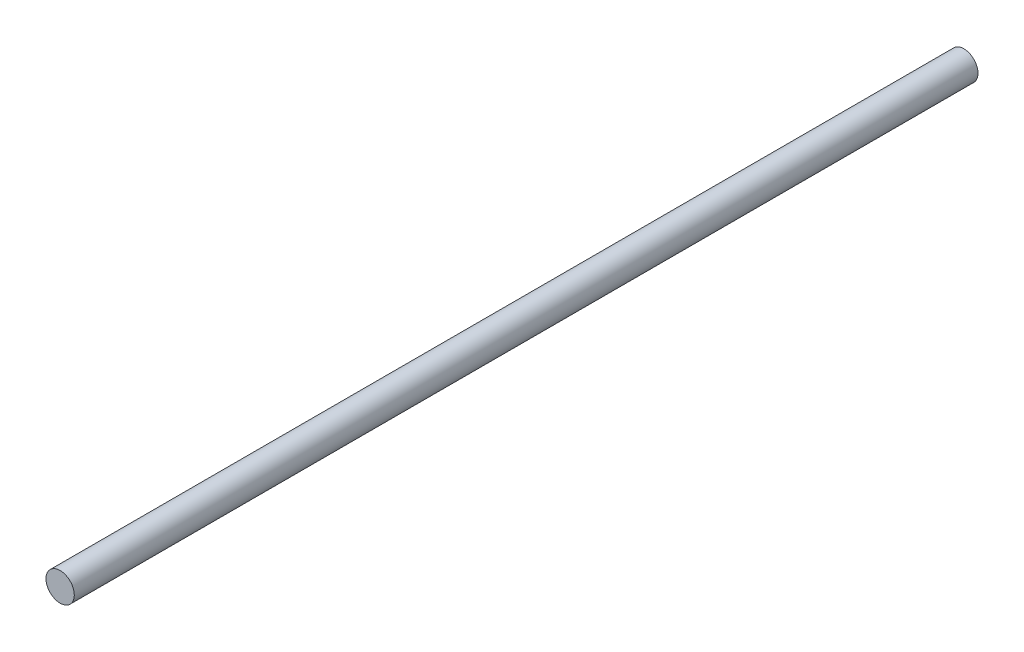
ISO-10303-21;
HEADER;
FILE_DESCRIPTION(('STEP AP214'),'2;1');
FILE_NAME('part.step','',(''),(''),'','','');
FILE_SCHEMA(('AUTOMOTIVE_DESIGN { 1 0 10303 214 1 1 1 1 }'));
ENDSEC;
DATA;
#1=APPLICATION_CONTEXT('core data for automotive mechanical design processes');
#2=APPLICATION_PROTOCOL_DEFINITION('international standard','automotive_design',2000,#1);
#3=PRODUCT_CONTEXT('',#1,'mechanical');
#4=PRODUCT('Part','Part','',(#3));
#5=PRODUCT_RELATED_PRODUCT_CATEGORY('part','',(#4));
#6=PRODUCT_DEFINITION_FORMATION('','',#4);
#7=PRODUCT_DEFINITION_CONTEXT('part definition',#1,'design');
#8=PRODUCT_DEFINITION('design','',#6,#7);
#9=PRODUCT_DEFINITION_SHAPE('','',#8);
#10=(LENGTH_UNIT() NAMED_UNIT(*) SI_UNIT(.MILLI.,.METRE.));
#11=(NAMED_UNIT(*) PLANE_ANGLE_UNIT() SI_UNIT($,.RADIAN.));
#12=(NAMED_UNIT(*) SI_UNIT($,.STERADIAN.) SOLID_ANGLE_UNIT());
#13=UNCERTAINTY_MEASURE_WITH_UNIT(LENGTH_MEASURE(1.E-05),#10,'distance_accuracy_value','');
#14=(GEOMETRIC_REPRESENTATION_CONTEXT(3) GLOBAL_UNCERTAINTY_ASSIGNED_CONTEXT((#13)) GLOBAL_UNIT_ASSIGNED_CONTEXT((#10,
#11,#12)) REPRESENTATION_CONTEXT('',''));
#15=CARTESIAN_POINT('',(0.,0.,0.));
#16=DIRECTION('',(0.,0.,1.));
#17=DIRECTION('',(1.,0.,0.));
#18=AXIS2_PLACEMENT_3D('',#15,#16,#17);
#19=CARTESIAN_POINT('',(0.,0.,300.));
#20=DIRECTION('',(0.,0.,-1.));
#21=DIRECTION('',(-1.,0.,0.));
#22=AXIS2_PLACEMENT_3D('',#19,#20,#21);
#23=CYLINDRICAL_SURFACE('',#22,4.7);
#24=CARTESIAN_POINT('',(0.,0.,300.));
#25=DIRECTION('',(0.,0.,1.));
#26=DIRECTION('',(1.,0.,0.));
#27=AXIS2_PLACEMENT_3D('',#24,#25,#26);
#28=CIRCLE('',#27,4.7);
#29=CARTESIAN_POINT('',(4.7,0.,300.));
#30=VERTEX_POINT('',#29);
#31=EDGE_CURVE('E10',#30,#30,#28,.T.);
#32=ORIENTED_EDGE('',*,*,#31,.F.);
#33=EDGE_LOOP('',(#32));
#34=FACE_BOUND('',#33,.T.);
#35=CARTESIAN_POINT('',(0.,0.,0.));
#36=DIRECTION('',(0.,0.,1.));
#37=DIRECTION('',(1.,0.,0.));
#38=AXIS2_PLACEMENT_3D('',#35,#36,#37);
#39=CIRCLE('',#38,4.7);
#40=CARTESIAN_POINT('',(4.7,0.,0.));
#41=VERTEX_POINT('',#40);
#42=EDGE_CURVE('E40',#41,#41,#39,.T.);
#43=ORIENTED_EDGE('',*,*,#42,.T.);
#44=EDGE_LOOP('',(#43));
#45=FACE_BOUND('',#44,.T.);
#46=ADVANCED_FACE('F37',(#34,#45),#23,.T.);
#47=CARTESIAN_POINT('',(0.,0.,300.));
#48=DIRECTION('',(0.,0.,1.));
#49=DIRECTION('',(1.,0.,0.));
#50=AXIS2_PLACEMENT_3D('',#47,#48,#49);
#51=PLANE('',#50);
#52=ORIENTED_EDGE('',*,*,#31,.T.);
#53=EDGE_LOOP('',(#52));
#54=FACE_BOUND('',#53,.T.);
#55=ADVANCED_FACE('F54',(#54),#51,.T.);
#56=CARTESIAN_POINT('',(0.,0.,0.));
#57=DIRECTION('',(0.,0.,1.));
#58=DIRECTION('',(1.,0.,0.));
#59=AXIS2_PLACEMENT_3D('',#56,#57,#58);
#60=PLANE('',#59);
#61=ORIENTED_EDGE('',*,*,#42,.F.);
#62=EDGE_LOOP('',(#61));
#63=FACE_BOUND('',#62,.T.);
#64=ADVANCED_FACE('F52',(#63),#60,.F.);
#65=CLOSED_SHELL('',(#46,#55,#64));
#66=MANIFOLD_SOLID_BREP('B2',#65);
#67=ADVANCED_BREP_SHAPE_REPRESENTATION('',(#18,#66),#14);
#68=SHAPE_DEFINITION_REPRESENTATION(#9,#67);
ENDSEC;
END-ISO-10303-21;
